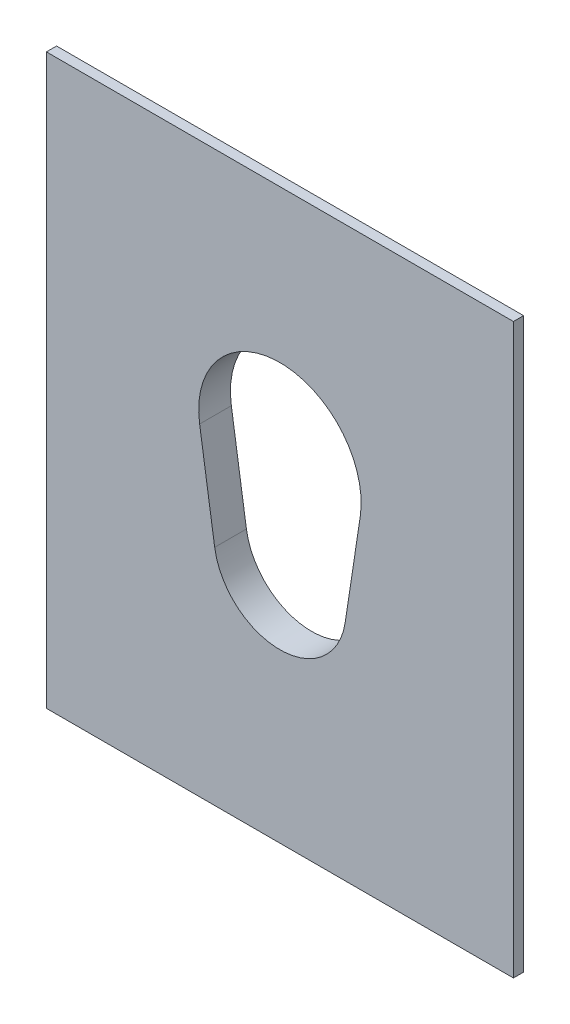
ISO-10303-21;
HEADER;
FILE_DESCRIPTION(('STEP AP214'),'2;1');
FILE_NAME('part.step','',(''),(''),'','','');
FILE_SCHEMA(('AUTOMOTIVE_DESIGN { 1 0 10303 214 1 1 1 1 }'));
ENDSEC;
DATA;
#1=APPLICATION_CONTEXT('core data for automotive mechanical design processes');
#2=APPLICATION_PROTOCOL_DEFINITION('international standard','automotive_design',2000,#1);
#3=PRODUCT_CONTEXT('',#1,'mechanical');
#4=PRODUCT('Part','Part','',(#3));
#5=PRODUCT_RELATED_PRODUCT_CATEGORY('part','',(#4));
#6=PRODUCT_DEFINITION_FORMATION('','',#4);
#7=PRODUCT_DEFINITION_CONTEXT('part definition',#1,'design');
#8=PRODUCT_DEFINITION('design','',#6,#7);
#9=PRODUCT_DEFINITION_SHAPE('','',#8);
#10=(LENGTH_UNIT() NAMED_UNIT(*) SI_UNIT(.MILLI.,.METRE.));
#11=(NAMED_UNIT(*) PLANE_ANGLE_UNIT() SI_UNIT($,.RADIAN.));
#12=(NAMED_UNIT(*) SI_UNIT($,.STERADIAN.) SOLID_ANGLE_UNIT());
#13=UNCERTAINTY_MEASURE_WITH_UNIT(LENGTH_MEASURE(1.E-05),#10,'distance_accuracy_value','');
#14=(GEOMETRIC_REPRESENTATION_CONTEXT(3) GLOBAL_UNCERTAINTY_ASSIGNED_CONTEXT((#13)) GLOBAL_UNIT_ASSIGNED_CONTEXT((#10,
#11,#12)) REPRESENTATION_CONTEXT('',''));
#15=CARTESIAN_POINT('',(0.,0.,0.));
#16=DIRECTION('',(0.,0.,1.));
#17=DIRECTION('',(1.,0.,0.));
#18=AXIS2_PLACEMENT_3D('',#15,#16,#17);
#19=CARTESIAN_POINT('',(0.,0.,1.5625));
#20=DIRECTION('',(0.,0.,1.));
#21=DIRECTION('',(1.,0.,0.));
#22=AXIS2_PLACEMENT_3D('',#19,#20,#21);
#23=PLANE('',#22);
#24=DIRECTION('',(0.15,0.988685996664259,0.));
#25=VECTOR('',#24,1.);
#26=CARTESIAN_POINT('',(6.42645897831769,-0.975000000000001,1.5625));
#27=LINE('',#26,#25);
#28=CARTESIAN_POINT('',(6.42645897831769,-0.975000000000001,1.5625));
#29=VERTEX_POINT('',#28);
#30=CARTESIAN_POINT('',(7.90948797331408,8.8,1.5625));
#31=VERTEX_POINT('',#30);
#32=EDGE_CURVE('E182',#29,#31,#27,.T.);
#33=ORIENTED_EDGE('',*,*,#32,.F.);
#34=CARTESIAN_POINT('',(0.,0.,1.5625));
#35=DIRECTION('',(0.,0.,1.));
#36=DIRECTION('',(1.,0.,0.));
#37=AXIS2_PLACEMENT_3D('',#34,#35,#36);
#38=CIRCLE('',#37,6.5);
#39=CARTESIAN_POINT('',(-6.42645897831769,-0.975000000000001,1.5625));
#40=VERTEX_POINT('',#39);
#41=EDGE_CURVE('E168',#40,#29,#38,.T.);
#42=ORIENTED_EDGE('',*,*,#41,.F.);
#43=DIRECTION('',(0.15,-0.988685996664259,0.));
#44=VECTOR('',#43,1.);
#45=CARTESIAN_POINT('',(-6.42645897831769,-0.975000000000001,1.5625));
#46=LINE('',#45,#44);
#47=CARTESIAN_POINT('',(-7.90948797331408,8.8,1.5625));
#48=VERTEX_POINT('',#47);
#49=EDGE_CURVE('E164',#48,#40,#46,.T.);
#50=ORIENTED_EDGE('',*,*,#49,.F.);
#51=CARTESIAN_POINT('',(0.,10.,1.5625));
#52=DIRECTION('',(0.,0.,1.));
#53=DIRECTION('',(-1.,0.,0.));
#54=AXIS2_PLACEMENT_3D('',#51,#52,#53);
#55=CIRCLE('',#54,8.);
#56=EDGE_CURVE('E180',#31,#48,#55,.T.);
#57=ORIENTED_EDGE('',*,*,#56,.F.);
#58=EDGE_LOOP('',(#33,#42,#50,#57));
#59=FACE_BOUND('',#58,.T.);
#60=DIRECTION('',(-1.,0.,0.));
#61=VECTOR('',#60,1.);
#62=CARTESIAN_POINT('',(23.,-23.,1.5625));
#63=LINE('',#62,#61);
#64=CARTESIAN_POINT('',(23.,-23.,1.5625));
#65=VERTEX_POINT('',#64);
#66=CARTESIAN_POINT('',(-23.,-23.,1.5625));
#67=VERTEX_POINT('',#66);
#68=EDGE_CURVE('E204',#65,#67,#63,.T.);
#69=ORIENTED_EDGE('',*,*,#68,.F.);
#70=DIRECTION('',(0.,-1.,0.));
#71=VECTOR('',#70,1.);
#72=CARTESIAN_POINT('',(23.,33.,1.5625));
#73=LINE('',#72,#71);
#74=CARTESIAN_POINT('',(23.,33.,1.5625));
#75=VERTEX_POINT('',#74);
#76=EDGE_CURVE('E197',#75,#65,#73,.T.);
#77=ORIENTED_EDGE('',*,*,#76,.F.);
#78=DIRECTION('',(1.,0.,0.));
#79=VECTOR('',#78,1.);
#80=CARTESIAN_POINT('',(-23.,33.,1.5625));
#81=LINE('',#80,#79);
#82=CARTESIAN_POINT('',(-23.,33.,1.5625));
#83=VERTEX_POINT('',#82);
#84=EDGE_CURVE('E200',#83,#75,#81,.T.);
#85=ORIENTED_EDGE('',*,*,#84,.F.);
#86=DIRECTION('',(0.,1.,0.));
#87=VECTOR('',#86,1.);
#88=CARTESIAN_POINT('',(-23.,-23.,1.5625));
#89=LINE('',#88,#87);
#90=EDGE_CURVE('E202',#67,#83,#89,.T.);
#91=ORIENTED_EDGE('',*,*,#90,.F.);
#92=EDGE_LOOP('',(#69,#77,#85,#91));
#93=FACE_BOUND('',#92,.T.);
#94=ADVANCED_FACE('F36',(#59,#93),#23,.T.);
#95=CARTESIAN_POINT('',(0.,0.,-1.5625));
#96=DIRECTION('',(0.,0.,1.));
#97=DIRECTION('',(1.,0.,0.));
#98=AXIS2_PLACEMENT_3D('',#95,#96,#97);
#99=PLANE('',#98);
#100=DIRECTION('',(0.,-1.,0.));
#101=VECTOR('',#100,1.);
#102=CARTESIAN_POINT('',(-13.,23.,-1.5625));
#103=LINE('',#102,#101);
#104=CARTESIAN_POINT('',(-13.,23.,-1.5625));
#105=VERTEX_POINT('',#104);
#106=CARTESIAN_POINT('',(-13.,-13.,-1.5625));
#107=VERTEX_POINT('',#106);
#108=EDGE_CURVE('E152',#105,#107,#103,.T.);
#109=ORIENTED_EDGE('',*,*,#108,.F.);
#110=DIRECTION('',(-1.,0.,0.));
#111=VECTOR('',#110,1.);
#112=CARTESIAN_POINT('',(-13.,23.,-1.5625));
#113=LINE('',#112,#111);
#114=CARTESIAN_POINT('',(13.,23.,-1.5625));
#115=VERTEX_POINT('',#114);
#116=EDGE_CURVE('E146',#115,#105,#113,.T.);
#117=ORIENTED_EDGE('',*,*,#116,.F.);
#118=DIRECTION('',(0.,1.,0.));
#119=VECTOR('',#118,1.);
#120=CARTESIAN_POINT('',(13.,23.,-1.5625));
#121=LINE('',#120,#119);
#122=CARTESIAN_POINT('',(13.,-13.,-1.5625));
#123=VERTEX_POINT('',#122);
#124=EDGE_CURVE('E149',#123,#115,#121,.T.);
#125=ORIENTED_EDGE('',*,*,#124,.F.);
#126=DIRECTION('',(1.,0.,0.));
#127=VECTOR('',#126,1.);
#128=CARTESIAN_POINT('',(-13.,-13.,-1.5625));
#129=LINE('',#128,#127);
#130=EDGE_CURVE('E140',#107,#123,#129,.T.);
#131=ORIENTED_EDGE('',*,*,#130,.F.);
#132=EDGE_LOOP('',(#109,#117,#125,#131));
#133=FACE_BOUND('',#132,.T.);
#134=CARTESIAN_POINT('',(0.,0.,-1.5625));
#135=DIRECTION('',(0.,0.,1.));
#136=DIRECTION('',(1.,0.,0.));
#137=AXIS2_PLACEMENT_3D('',#134,#135,#136);
#138=CIRCLE('',#137,6.5);
#139=CARTESIAN_POINT('',(-6.42645897831769,-0.975000000000001,-1.5625));
#140=VERTEX_POINT('',#139);
#141=CARTESIAN_POINT('',(6.42645897831769,-0.975000000000001,-1.5625));
#142=VERTEX_POINT('',#141);
#143=EDGE_CURVE('E175',#140,#142,#138,.T.);
#144=ORIENTED_EDGE('',*,*,#143,.T.);
#145=DIRECTION('',(0.15,0.988685996664259,0.));
#146=VECTOR('',#145,1.);
#147=CARTESIAN_POINT('',(6.42645897831769,-0.975000000000001,-1.5625));
#148=LINE('',#147,#146);
#149=CARTESIAN_POINT('',(7.90948797331408,8.8,-1.5625));
#150=VERTEX_POINT('',#149);
#151=EDGE_CURVE('E172',#142,#150,#148,.T.);
#152=ORIENTED_EDGE('',*,*,#151,.T.);
#153=CARTESIAN_POINT('',(0.,10.,-1.5625));
#154=DIRECTION('',(0.,0.,1.));
#155=DIRECTION('',(-1.,0.,0.));
#156=AXIS2_PLACEMENT_3D('',#153,#154,#155);
#157=CIRCLE('',#156,8.);
#158=CARTESIAN_POINT('',(-7.90948797331408,8.8,-1.5625));
#159=VERTEX_POINT('',#158);
#160=EDGE_CURVE('E169',#150,#159,#157,.T.);
#161=ORIENTED_EDGE('',*,*,#160,.T.);
#162=DIRECTION('',(0.15,-0.988685996664259,0.));
#163=VECTOR('',#162,1.);
#164=CARTESIAN_POINT('',(-6.42645897831769,-0.975000000000001,-1.5625));
#165=LINE('',#164,#163);
#166=EDGE_CURVE('E165',#159,#140,#165,.T.);
#167=ORIENTED_EDGE('',*,*,#166,.T.);
#168=EDGE_LOOP('',(#144,#152,#161,#167));
#169=FACE_BOUND('',#168,.T.);
#170=ADVANCED_FACE('F221',(#133,#169),#99,.F.);
#171=CARTESIAN_POINT('',(-13.,23.,1.5625));
#172=DIRECTION('',(1.,0.,0.));
#173=DIRECTION('',(0.,0.,-1.));
#174=AXIS2_PLACEMENT_3D('',#171,#172,#173);
#175=PLANE('',#174);
#176=DIRECTION('',(0.,0.,-1.));
#177=VECTOR('',#176,1.);
#178=CARTESIAN_POINT('',(-13.,-13.,1.5625));
#179=LINE('',#178,#177);
#180=CARTESIAN_POINT('',(-13.,-13.,0.5625));
#181=VERTEX_POINT('',#180);
#182=EDGE_CURVE('E11',#181,#107,#179,.T.);
#183=ORIENTED_EDGE('',*,*,#182,.F.);
#184=DIRECTION('',(0.,1.,0.));
#185=VECTOR('',#184,1.);
#186=CARTESIAN_POINT('',(-13.,-13.,0.5625));
#187=LINE('',#186,#185);
#188=CARTESIAN_POINT('',(-13.,23.,0.5625));
#189=VERTEX_POINT('',#188);
#190=EDGE_CURVE('E125',#181,#189,#187,.T.);
#191=ORIENTED_EDGE('',*,*,#190,.T.);
#192=DIRECTION('',(0.,0.,-1.));
#193=VECTOR('',#192,1.);
#194=CARTESIAN_POINT('',(-13.,23.,1.5625));
#195=LINE('',#194,#193);
#196=EDGE_CURVE('E142',#189,#105,#195,.T.);
#197=ORIENTED_EDGE('',*,*,#196,.T.);
#198=ORIENTED_EDGE('',*,*,#108,.T.);
#199=EDGE_LOOP('',(#183,#191,#197,#198));
#200=FACE_BOUND('',#199,.T.);
#201=ADVANCED_FACE('F38',(#200),#175,.F.);
#202=CARTESIAN_POINT('',(-13.,-13.,1.5625));
#203=DIRECTION('',(0.,1.,0.));
#204=DIRECTION('',(0.,0.,1.));
#205=AXIS2_PLACEMENT_3D('',#202,#203,#204);
#206=PLANE('',#205);
#207=DIRECTION('',(0.,0.,-1.));
#208=VECTOR('',#207,1.);
#209=CARTESIAN_POINT('',(13.,-13.,1.5625));
#210=LINE('',#209,#208);
#211=CARTESIAN_POINT('',(13.,-13.,0.5625));
#212=VERTEX_POINT('',#211);
#213=EDGE_CURVE('E44',#212,#123,#210,.T.);
#214=ORIENTED_EDGE('',*,*,#213,.F.);
#215=DIRECTION('',(-1.,0.,0.));
#216=VECTOR('',#215,1.);
#217=CARTESIAN_POINT('',(13.,-13.,0.5625));
#218=LINE('',#217,#216);
#219=EDGE_CURVE('E122',#212,#181,#218,.T.);
#220=ORIENTED_EDGE('',*,*,#219,.T.);
#221=ORIENTED_EDGE('',*,*,#182,.T.);
#222=ORIENTED_EDGE('',*,*,#130,.T.);
#223=EDGE_LOOP('',(#214,#220,#221,#222));
#224=FACE_BOUND('',#223,.T.);
#225=ADVANCED_FACE('F138',(#224),#206,.F.);
#226=CARTESIAN_POINT('',(13.,23.,1.5625));
#227=DIRECTION('',(-1.,0.,0.));
#228=DIRECTION('',(0.,0.,1.));
#229=AXIS2_PLACEMENT_3D('',#226,#227,#228);
#230=PLANE('',#229);
#231=DIRECTION('',(0.,0.,-1.));
#232=VECTOR('',#231,1.);
#233=CARTESIAN_POINT('',(13.,23.,1.5625));
#234=LINE('',#233,#232);
#235=CARTESIAN_POINT('',(13.,23.,0.5625));
#236=VERTEX_POINT('',#235);
#237=EDGE_CURVE('E135',#236,#115,#234,.T.);
#238=ORIENTED_EDGE('',*,*,#237,.F.);
#239=DIRECTION('',(0.,-1.,0.));
#240=VECTOR('',#239,1.);
#241=CARTESIAN_POINT('',(13.,23.,0.5625));
#242=LINE('',#241,#240);
#243=EDGE_CURVE('E51',#236,#212,#242,.T.);
#244=ORIENTED_EDGE('',*,*,#243,.T.);
#245=ORIENTED_EDGE('',*,*,#213,.T.);
#246=ORIENTED_EDGE('',*,*,#124,.T.);
#247=EDGE_LOOP('',(#238,#244,#245,#246));
#248=FACE_BOUND('',#247,.T.);
#249=ADVANCED_FACE('F132',(#248),#230,.F.);
#250=CARTESIAN_POINT('',(-13.,23.,1.5625));
#251=DIRECTION('',(0.,-1.,0.));
#252=DIRECTION('',(0.,0.,-1.));
#253=AXIS2_PLACEMENT_3D('',#250,#251,#252);
#254=PLANE('',#253);
#255=ORIENTED_EDGE('',*,*,#196,.F.);
#256=DIRECTION('',(1.,0.,0.));
#257=VECTOR('',#256,1.);
#258=CARTESIAN_POINT('',(-13.,23.,0.5625));
#259=LINE('',#258,#257);
#260=EDGE_CURVE('E136',#189,#236,#259,.T.);
#261=ORIENTED_EDGE('',*,*,#260,.T.);
#262=ORIENTED_EDGE('',*,*,#237,.T.);
#263=ORIENTED_EDGE('',*,*,#116,.T.);
#264=EDGE_LOOP('',(#255,#261,#262,#263));
#265=FACE_BOUND('',#264,.T.);
#266=ADVANCED_FACE('F217',(#265),#254,.F.);
#267=CARTESIAN_POINT('',(0.,0.,1.5625));
#268=DIRECTION('',(0.,0.,-1.));
#269=DIRECTION('',(-1.,0.,0.));
#270=AXIS2_PLACEMENT_3D('',#267,#268,#269);
#271=CYLINDRICAL_SURFACE('',#270,6.5);
#272=ORIENTED_EDGE('',*,*,#143,.F.);
#273=DIRECTION('',(0.,0.,-1.));
#274=VECTOR('',#273,1.);
#275=CARTESIAN_POINT('',(-6.42645897831769,-0.975000000000001,1.5625));
#276=LINE('',#275,#274);
#277=EDGE_CURVE('E161',#40,#140,#276,.T.);
#278=ORIENTED_EDGE('',*,*,#277,.F.);
#279=ORIENTED_EDGE('',*,*,#41,.T.);
#280=DIRECTION('',(0.,0.,-1.));
#281=VECTOR('',#280,1.);
#282=CARTESIAN_POINT('',(6.42645897831769,-0.975000000000001,1.5625));
#283=LINE('',#282,#281);
#284=EDGE_CURVE('E155',#29,#142,#283,.T.);
#285=ORIENTED_EDGE('',*,*,#284,.T.);
#286=EDGE_LOOP('',(#272,#278,#279,#285));
#287=FACE_BOUND('',#286,.T.);
#288=ADVANCED_FACE('F228',(#287),#271,.F.);
#289=CARTESIAN_POINT('',(6.42645897831769,-0.975000000000001,1.5625));
#290=DIRECTION('',(-0.988685996664259,0.15,0.));
#291=DIRECTION('',(-0.15,-0.988685996664259,0.));
#292=AXIS2_PLACEMENT_3D('',#289,#290,#291);
#293=PLANE('',#292);
#294=ORIENTED_EDGE('',*,*,#151,.F.);
#295=ORIENTED_EDGE('',*,*,#284,.F.);
#296=ORIENTED_EDGE('',*,*,#32,.T.);
#297=DIRECTION('',(0.,0.,-1.));
#298=VECTOR('',#297,1.);
#299=CARTESIAN_POINT('',(7.90948797331408,8.8,1.5625));
#300=LINE('',#299,#298);
#301=EDGE_CURVE('E158',#31,#150,#300,.T.);
#302=ORIENTED_EDGE('',*,*,#301,.T.);
#303=EDGE_LOOP('',(#294,#295,#296,#302));
#304=FACE_BOUND('',#303,.T.);
#305=ADVANCED_FACE('F238',(#304),#293,.T.);
#306=CARTESIAN_POINT('',(0.,10.,1.5625));
#307=DIRECTION('',(0.,0.,-1.));
#308=DIRECTION('',(-1.,0.,0.));
#309=AXIS2_PLACEMENT_3D('',#306,#307,#308);
#310=CYLINDRICAL_SURFACE('',#309,8.);
#311=ORIENTED_EDGE('',*,*,#160,.F.);
#312=ORIENTED_EDGE('',*,*,#301,.F.);
#313=ORIENTED_EDGE('',*,*,#56,.T.);
#314=DIRECTION('',(0.,0.,-1.));
#315=VECTOR('',#314,1.);
#316=CARTESIAN_POINT('',(-7.90948797331408,8.8,1.5625));
#317=LINE('',#316,#315);
#318=EDGE_CURVE('E59',#48,#159,#317,.T.);
#319=ORIENTED_EDGE('',*,*,#318,.T.);
#320=EDGE_LOOP('',(#311,#312,#313,#319));
#321=FACE_BOUND('',#320,.T.);
#322=ADVANCED_FACE('F242',(#321),#310,.F.);
#323=CARTESIAN_POINT('',(-6.42645897831769,-0.975000000000001,1.5625));
#324=DIRECTION('',(0.988685996664259,0.15,0.));
#325=DIRECTION('',(-0.15,0.98868599666426,0.));
#326=AXIS2_PLACEMENT_3D('',#323,#324,#325);
#327=PLANE('',#326);
#328=ORIENTED_EDGE('',*,*,#166,.F.);
#329=ORIENTED_EDGE('',*,*,#318,.F.);
#330=ORIENTED_EDGE('',*,*,#49,.T.);
#331=ORIENTED_EDGE('',*,*,#277,.T.);
#332=EDGE_LOOP('',(#328,#329,#330,#331));
#333=FACE_BOUND('',#332,.T.);
#334=ADVANCED_FACE('F231',(#333),#327,.T.);
#335=CARTESIAN_POINT('',(0.,0.,0.5625));
#336=DIRECTION('',(0.,0.,-1.));
#337=DIRECTION('',(-1.,0.,0.));
#338=AXIS2_PLACEMENT_3D('',#335,#336,#337);
#339=PLANE('',#338);
#340=DIRECTION('',(-1.,0.,0.));
#341=VECTOR('',#340,1.);
#342=CARTESIAN_POINT('',(23.,-23.,0.5625));
#343=LINE('',#342,#341);
#344=CARTESIAN_POINT('',(23.,-23.,0.5625));
#345=VERTEX_POINT('',#344);
#346=CARTESIAN_POINT('',(-23.,-23.,0.5625));
#347=VERTEX_POINT('',#346);
#348=EDGE_CURVE('E199',#345,#347,#343,.T.);
#349=ORIENTED_EDGE('',*,*,#348,.T.);
#350=DIRECTION('',(0.,1.,0.));
#351=VECTOR('',#350,1.);
#352=CARTESIAN_POINT('',(-23.,-23.,0.5625));
#353=LINE('',#352,#351);
#354=CARTESIAN_POINT('',(-23.,33.,0.5625));
#355=VERTEX_POINT('',#354);
#356=EDGE_CURVE('E210',#347,#355,#353,.T.);
#357=ORIENTED_EDGE('',*,*,#356,.T.);
#358=DIRECTION('',(1.,0.,0.));
#359=VECTOR('',#358,1.);
#360=CARTESIAN_POINT('',(-23.,33.,0.5625));
#361=LINE('',#360,#359);
#362=CARTESIAN_POINT('',(23.,33.,0.5625));
#363=VERTEX_POINT('',#362);
#364=EDGE_CURVE('E208',#355,#363,#361,.T.);
#365=ORIENTED_EDGE('',*,*,#364,.T.);
#366=DIRECTION('',(0.,-1.,0.));
#367=VECTOR('',#366,1.);
#368=CARTESIAN_POINT('',(23.,33.,0.5625));
#369=LINE('',#368,#367);
#370=EDGE_CURVE('E196',#363,#345,#369,.T.);
#371=ORIENTED_EDGE('',*,*,#370,.T.);
#372=EDGE_LOOP('',(#349,#357,#365,#371));
#373=FACE_BOUND('',#372,.T.);
#374=ORIENTED_EDGE('',*,*,#243,.F.);
#375=ORIENTED_EDGE('',*,*,#260,.F.);
#376=ORIENTED_EDGE('',*,*,#190,.F.);
#377=ORIENTED_EDGE('',*,*,#219,.F.);
#378=EDGE_LOOP('',(#374,#375,#376,#377));
#379=FACE_BOUND('',#378,.T.);
#380=ADVANCED_FACE('F123',(#373,#379),#339,.T.);
#381=CARTESIAN_POINT('',(23.,-23.,0.5625));
#382=DIRECTION('',(0.,1.,0.));
#383=DIRECTION('',(0.,0.,1.));
#384=AXIS2_PLACEMENT_3D('',#381,#382,#383);
#385=PLANE('',#384);
#386=ORIENTED_EDGE('',*,*,#68,.T.);
#387=DIRECTION('',(0.,0.,1.));
#388=VECTOR('',#387,1.);
#389=CARTESIAN_POINT('',(-23.,-23.,0.5625));
#390=LINE('',#389,#388);
#391=EDGE_CURVE('E178',#347,#67,#390,.T.);
#392=ORIENTED_EDGE('',*,*,#391,.F.);
#393=ORIENTED_EDGE('',*,*,#348,.F.);
#394=DIRECTION('',(0.,0.,1.));
#395=VECTOR('',#394,1.);
#396=CARTESIAN_POINT('',(23.,-23.,0.5625));
#397=LINE('',#396,#395);
#398=EDGE_CURVE('E193',#345,#65,#397,.T.);
#399=ORIENTED_EDGE('',*,*,#398,.T.);
#400=EDGE_LOOP('',(#386,#392,#393,#399));
#401=FACE_BOUND('',#400,.T.);
#402=ADVANCED_FACE('F311',(#401),#385,.F.);
#403=CARTESIAN_POINT('',(-23.,-23.,0.5625));
#404=DIRECTION('',(1.,0.,0.));
#405=DIRECTION('',(0.,0.,-1.));
#406=AXIS2_PLACEMENT_3D('',#403,#404,#405);
#407=PLANE('',#406);
#408=ORIENTED_EDGE('',*,*,#90,.T.);
#409=DIRECTION('',(0.,0.,1.));
#410=VECTOR('',#409,1.);
#411=CARTESIAN_POINT('',(-23.,33.,0.5625));
#412=LINE('',#411,#410);
#413=EDGE_CURVE('E187',#355,#83,#412,.T.);
#414=ORIENTED_EDGE('',*,*,#413,.F.);
#415=ORIENTED_EDGE('',*,*,#356,.F.);
#416=ORIENTED_EDGE('',*,*,#391,.T.);
#417=EDGE_LOOP('',(#408,#414,#415,#416));
#418=FACE_BOUND('',#417,.T.);
#419=ADVANCED_FACE('F321',(#418),#407,.F.);
#420=CARTESIAN_POINT('',(-23.,33.,0.5625));
#421=DIRECTION('',(0.,-1.,0.));
#422=DIRECTION('',(0.,0.,-1.));
#423=AXIS2_PLACEMENT_3D('',#420,#421,#422);
#424=PLANE('',#423);
#425=ORIENTED_EDGE('',*,*,#84,.T.);
#426=DIRECTION('',(0.,0.,1.));
#427=VECTOR('',#426,1.);
#428=CARTESIAN_POINT('',(23.,33.,0.5625));
#429=LINE('',#428,#427);
#430=EDGE_CURVE('E190',#363,#75,#429,.T.);
#431=ORIENTED_EDGE('',*,*,#430,.F.);
#432=ORIENTED_EDGE('',*,*,#364,.F.);
#433=ORIENTED_EDGE('',*,*,#413,.T.);
#434=EDGE_LOOP('',(#425,#431,#432,#433));
#435=FACE_BOUND('',#434,.T.);
#436=ADVANCED_FACE('F330',(#435),#424,.F.);
#437=CARTESIAN_POINT('',(23.,33.,0.5625));
#438=DIRECTION('',(-1.,0.,0.));
#439=DIRECTION('',(0.,0.,1.));
#440=AXIS2_PLACEMENT_3D('',#437,#438,#439);
#441=PLANE('',#440);
#442=ORIENTED_EDGE('',*,*,#76,.T.);
#443=ORIENTED_EDGE('',*,*,#398,.F.);
#444=ORIENTED_EDGE('',*,*,#370,.F.);
#445=ORIENTED_EDGE('',*,*,#430,.T.);
#446=EDGE_LOOP('',(#442,#443,#444,#445));
#447=FACE_BOUND('',#446,.T.);
#448=ADVANCED_FACE('F339',(#447),#441,.F.);
#449=CLOSED_SHELL('',(#94,#170,#201,#225,#249,#266,#288,#305,#322,#334,#380,#402,#419,#436,#448));
#450=MANIFOLD_SOLID_BREP('B2',#449);
#451=ADVANCED_BREP_SHAPE_REPRESENTATION('',(#18,#450),#14);
#452=SHAPE_DEFINITION_REPRESENTATION(#9,#451);
ENDSEC;
END-ISO-10303-21;
